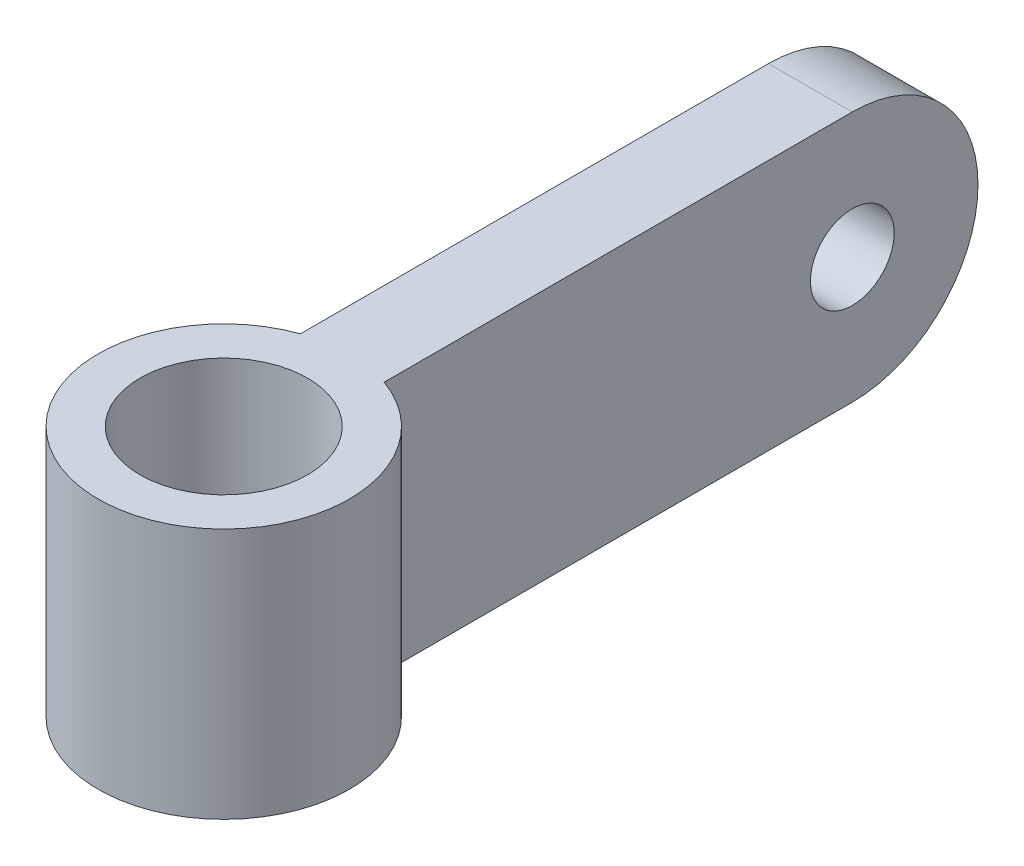
ISO-10303-21;
HEADER;
FILE_DESCRIPTION(('STEP AP214'),'2;1');
FILE_NAME('part.step','',(''),(''),'','','');
FILE_SCHEMA(('AUTOMOTIVE_DESIGN { 1 0 10303 214 1 1 1 1 }'));
ENDSEC;
DATA;
#1=APPLICATION_CONTEXT('core data for automotive mechanical design processes');
#2=APPLICATION_PROTOCOL_DEFINITION('international standard','automotive_design',2000,#1);
#3=PRODUCT_CONTEXT('',#1,'mechanical');
#4=PRODUCT('Part','Part','',(#3));
#5=PRODUCT_RELATED_PRODUCT_CATEGORY('part','',(#4));
#6=PRODUCT_DEFINITION_FORMATION('','',#4);
#7=PRODUCT_DEFINITION_CONTEXT('part definition',#1,'design');
#8=PRODUCT_DEFINITION('design','',#6,#7);
#9=PRODUCT_DEFINITION_SHAPE('','',#8);
#10=(LENGTH_UNIT() NAMED_UNIT(*) SI_UNIT(.MILLI.,.METRE.));
#11=(NAMED_UNIT(*) PLANE_ANGLE_UNIT() SI_UNIT($,.RADIAN.));
#12=(NAMED_UNIT(*) SI_UNIT($,.STERADIAN.) SOLID_ANGLE_UNIT());
#13=UNCERTAINTY_MEASURE_WITH_UNIT(LENGTH_MEASURE(1.E-05),#10,'distance_accuracy_value','');
#14=(GEOMETRIC_REPRESENTATION_CONTEXT(3) GLOBAL_UNCERTAINTY_ASSIGNED_CONTEXT((#13)) GLOBAL_UNIT_ASSIGNED_CONTEXT((#10,
#11,#12)) REPRESENTATION_CONTEXT('',''));
#15=CARTESIAN_POINT('',(0.,0.,0.));
#16=DIRECTION('',(0.,0.,1.));
#17=DIRECTION('',(1.,0.,0.));
#18=AXIS2_PLACEMENT_3D('',#15,#16,#17);
#19=CARTESIAN_POINT('',(0.,30.,0.));
#20=DIRECTION('',(0.,-1.,0.));
#21=DIRECTION('',(0.,0.,-1.));
#22=AXIS2_PLACEMENT_3D('',#19,#20,#21);
#23=CYLINDRICAL_SURFACE('',#22,30.);
#24=DIRECTION('',(0.,-1.,0.));
#25=VECTOR('',#24,1.);
#26=CARTESIAN_POINT('',(-10.,30.,-28.2842712474619));
#27=LINE('',#26,#25);
#28=CARTESIAN_POINT('',(-10.,30.,-28.2842712474619));
#29=VERTEX_POINT('',#28);
#30=CARTESIAN_POINT('',(-10.,-30.,-28.2842712474619));
#31=VERTEX_POINT('',#30);
#32=EDGE_CURVE('E137',#29,#31,#27,.T.);
#33=ORIENTED_EDGE('',*,*,#32,.T.);
#34=CARTESIAN_POINT('',(0.,-30.,0.));
#35=DIRECTION('',(0.,1.,0.));
#36=DIRECTION('',(0.,0.,1.));
#37=AXIS2_PLACEMENT_3D('',#34,#35,#36);
#38=CIRCLE('',#37,30.);
#39=CARTESIAN_POINT('',(10.,-30.,-28.2842712474576));
#40=VERTEX_POINT('',#39);
#41=EDGE_CURVE('E40',#31,#40,#38,.T.);
#42=ORIENTED_EDGE('',*,*,#41,.T.);
#43=DIRECTION('',(0.,-1.,0.));
#44=VECTOR('',#43,1.);
#45=CARTESIAN_POINT('',(10.,30.,-28.2842712474619));
#46=LINE('',#45,#44);
#47=CARTESIAN_POINT('',(10.,30.,-28.2842712474576));
#48=VERTEX_POINT('',#47);
#49=EDGE_CURVE('E105',#40,#48,#46,.F.);
#50=ORIENTED_EDGE('',*,*,#49,.T.);
#51=CARTESIAN_POINT('',(0.,30.,0.));
#52=DIRECTION('',(0.,1.,0.));
#53=DIRECTION('',(0.,0.,1.));
#54=AXIS2_PLACEMENT_3D('',#51,#52,#53);
#55=CIRCLE('',#54,30.);
#56=EDGE_CURVE('E11',#29,#48,#55,.T.);
#57=ORIENTED_EDGE('',*,*,#56,.F.);
#58=EDGE_LOOP('',(#33,#42,#50,#57));
#59=FACE_BOUND('',#58,.T.);
#60=ADVANCED_FACE('F37',(#59),#23,.T.);
#61=CARTESIAN_POINT('',(0.,30.,0.));
#62=DIRECTION('',(0.,1.,0.));
#63=DIRECTION('',(0.,0.,1.));
#64=AXIS2_PLACEMENT_3D('',#61,#62,#63);
#65=PLANE('',#64);
#66=DIRECTION('',(0.,0.,1.));
#67=VECTOR('',#66,1.);
#68=CARTESIAN_POINT('',(-10.,30.,-30.));
#69=LINE('',#68,#67);
#70=CARTESIAN_POINT('',(-10.,30.,-140.));
#71=VERTEX_POINT('',#70);
#72=EDGE_CURVE('E50',#71,#29,#69,.T.);
#73=ORIENTED_EDGE('',*,*,#72,.T.);
#74=ORIENTED_EDGE('',*,*,#56,.T.);
#75=DIRECTION('',(0.,0.,-1.));
#76=VECTOR('',#75,1.);
#77=CARTESIAN_POINT('',(10.,30.,500000.));
#78=LINE('',#77,#76);
#79=CARTESIAN_POINT('',(10.,30.,-140.));
#80=VERTEX_POINT('',#79);
#81=EDGE_CURVE('E106',#48,#80,#78,.T.);
#82=ORIENTED_EDGE('',*,*,#81,.T.);
#83=DIRECTION('',(-1.,0.,0.));
#84=VECTOR('',#83,1.);
#85=CARTESIAN_POINT('',(10.,30.,-140.));
#86=LINE('',#85,#84);
#87=EDGE_CURVE('E81',#80,#71,#86,.T.);
#88=ORIENTED_EDGE('',*,*,#87,.T.);
#89=EDGE_LOOP('',(#73,#74,#82,#88));
#90=FACE_BOUND('',#89,.T.);
#91=CARTESIAN_POINT('',(0.,30.,0.));
#92=DIRECTION('',(0.,1.,0.));
#93=DIRECTION('',(0.,0.,1.));
#94=AXIS2_PLACEMENT_3D('',#91,#92,#93);
#95=CIRCLE('',#94,20.);
#96=CARTESIAN_POINT('',(0.,30.,20.));
#97=VERTEX_POINT('',#96);
#98=EDGE_CURVE('E113',#97,#97,#95,.T.);
#99=ORIENTED_EDGE('',*,*,#98,.F.);
#100=EDGE_LOOP('',(#99));
#101=FACE_BOUND('',#100,.T.);
#102=ADVANCED_FACE('F130',(#90,#101),#65,.T.);
#103=CARTESIAN_POINT('',(0.,-30.,0.));
#104=DIRECTION('',(0.,1.,0.));
#105=DIRECTION('',(0.,0.,1.));
#106=AXIS2_PLACEMENT_3D('',#103,#104,#105);
#107=PLANE('',#106);
#108=ORIENTED_EDGE('',*,*,#41,.F.);
#109=DIRECTION('',(0.,0.,-1.));
#110=VECTOR('',#109,1.);
#111=CARTESIAN_POINT('',(-10.,-30.,-30.));
#112=LINE('',#111,#110);
#113=CARTESIAN_POINT('',(-10.,-30.,-140.));
#114=VERTEX_POINT('',#113);
#115=EDGE_CURVE('E58',#31,#114,#112,.T.);
#116=ORIENTED_EDGE('',*,*,#115,.T.);
#117=DIRECTION('',(-1.,0.,0.));
#118=VECTOR('',#117,1.);
#119=CARTESIAN_POINT('',(10.,-30.,-140.));
#120=LINE('',#119,#118);
#121=CARTESIAN_POINT('',(10.,-30.,-140.));
#122=VERTEX_POINT('',#121);
#123=EDGE_CURVE('E85',#114,#122,#120,.F.);
#124=ORIENTED_EDGE('',*,*,#123,.T.);
#125=DIRECTION('',(0.,0.,-1.));
#126=VECTOR('',#125,1.);
#127=CARTESIAN_POINT('',(10.,-30.,500000.));
#128=LINE('',#127,#126);
#129=EDGE_CURVE('E109',#40,#122,#128,.T.);
#130=ORIENTED_EDGE('',*,*,#129,.F.);
#131=EDGE_LOOP('',(#108,#116,#124,#130));
#132=FACE_BOUND('',#131,.T.);
#133=CARTESIAN_POINT('',(0.,-30.,0.));
#134=DIRECTION('',(0.,1.,0.));
#135=DIRECTION('',(0.,0.,1.));
#136=AXIS2_PLACEMENT_3D('',#133,#134,#135);
#137=CIRCLE('',#136,20.);
#138=CARTESIAN_POINT('',(0.,-30.,20.));
#139=VERTEX_POINT('',#138);
#140=EDGE_CURVE('E108',#139,#139,#137,.T.);
#141=ORIENTED_EDGE('',*,*,#140,.T.);
#142=EDGE_LOOP('',(#141));
#143=FACE_BOUND('',#142,.T.);
#144=ADVANCED_FACE('F92',(#132,#143),#107,.F.);
#145=CARTESIAN_POINT('',(0.,30.,0.));
#146=DIRECTION('',(0.,-1.,0.));
#147=DIRECTION('',(0.,0.,-1.));
#148=AXIS2_PLACEMENT_3D('',#145,#146,#147);
#149=CYLINDRICAL_SURFACE('',#148,20.);
#150=ORIENTED_EDGE('',*,*,#98,.T.);
#151=EDGE_LOOP('',(#150));
#152=FACE_BOUND('',#151,.T.);
#153=ORIENTED_EDGE('',*,*,#140,.F.);
#154=EDGE_LOOP('',(#153));
#155=FACE_BOUND('',#154,.T.);
#156=ADVANCED_FACE('F119',(#152,#155),#149,.F.);
#157=CARTESIAN_POINT('',(10.,-30.,500000.));
#158=DIRECTION('',(-1.,0.,0.));
#159=DIRECTION('',(0.,0.,1.));
#160=AXIS2_PLACEMENT_3D('',#157,#158,#159);
#161=PLANE('',#160);
#162=ORIENTED_EDGE('',*,*,#49,.F.);
#163=ORIENTED_EDGE('',*,*,#129,.T.);
#164=CARTESIAN_POINT('',(10.,0.,-140.));
#165=DIRECTION('',(1.,0.,0.));
#166=DIRECTION('',(0.,0.,-1.));
#167=AXIS2_PLACEMENT_3D('',#164,#165,#166);
#168=CIRCLE('',#167,30.);
#169=EDGE_CURVE('E80',#122,#80,#168,.T.);
#170=ORIENTED_EDGE('',*,*,#169,.T.);
#171=ORIENTED_EDGE('',*,*,#81,.F.);
#172=EDGE_LOOP('',(#162,#163,#170,#171));
#173=FACE_BOUND('',#172,.T.);
#174=CARTESIAN_POINT('',(10.,0.,-140.));
#175=DIRECTION('',(1.,0.,0.));
#176=DIRECTION('',(0.,0.,-1.));
#177=AXIS2_PLACEMENT_3D('',#174,#175,#176);
#178=CIRCLE('',#177,9.99999999999998);
#179=CARTESIAN_POINT('',(10.,0.,-150.));
#180=VERTEX_POINT('',#179);
#181=EDGE_CURVE('E98',#180,#180,#178,.T.);
#182=ORIENTED_EDGE('',*,*,#181,.F.);
#183=EDGE_LOOP('',(#182));
#184=FACE_BOUND('',#183,.T.);
#185=ADVANCED_FACE('F121',(#173,#184),#161,.F.);
#186=CARTESIAN_POINT('',(-10.,0.,-140.));
#187=DIRECTION('',(-1.,0.,0.));
#188=DIRECTION('',(0.,0.,1.));
#189=AXIS2_PLACEMENT_3D('',#186,#187,#188);
#190=CYLINDRICAL_SURFACE('',#189,30.);
#191=ORIENTED_EDGE('',*,*,#123,.F.);
#192=CARTESIAN_POINT('',(-10.,0.,-140.));
#193=DIRECTION('',(1.,0.,0.));
#194=DIRECTION('',(0.,0.,-1.));
#195=AXIS2_PLACEMENT_3D('',#192,#193,#194);
#196=CIRCLE('',#195,30.);
#197=EDGE_CURVE('E75',#71,#114,#196,.F.);
#198=ORIENTED_EDGE('',*,*,#197,.F.);
#199=ORIENTED_EDGE('',*,*,#87,.F.);
#200=ORIENTED_EDGE('',*,*,#169,.F.);
#201=EDGE_LOOP('',(#191,#198,#199,#200));
#202=FACE_BOUND('',#201,.T.);
#203=ADVANCED_FACE('F86',(#202),#190,.T.);
#204=CARTESIAN_POINT('',(-10.,0.,0.));
#205=DIRECTION('',(1.,0.,0.));
#206=DIRECTION('',(0.,0.,-1.));
#207=AXIS2_PLACEMENT_3D('',#204,#205,#206);
#208=PLANE('',#207);
#209=CARTESIAN_POINT('',(-10.,0.,-140.));
#210=DIRECTION('',(1.,0.,0.));
#211=DIRECTION('',(0.,0.,-1.));
#212=AXIS2_PLACEMENT_3D('',#209,#210,#211);
#213=CIRCLE('',#212,9.99999999999998);
#214=CARTESIAN_POINT('',(-10.,0.,-150.));
#215=VERTEX_POINT('',#214);
#216=EDGE_CURVE('E94',#215,#215,#213,.T.);
#217=ORIENTED_EDGE('',*,*,#216,.T.);
#218=EDGE_LOOP('',(#217));
#219=FACE_BOUND('',#218,.T.);
#220=ORIENTED_EDGE('',*,*,#72,.F.);
#221=ORIENTED_EDGE('',*,*,#197,.T.);
#222=ORIENTED_EDGE('',*,*,#115,.F.);
#223=ORIENTED_EDGE('',*,*,#32,.F.);
#224=EDGE_LOOP('',(#220,#221,#222,#223));
#225=FACE_BOUND('',#224,.T.);
#226=ADVANCED_FACE('F77',(#219,#225),#208,.F.);
#227=CARTESIAN_POINT('',(-30.,0.,-140.));
#228=DIRECTION('',(1.,0.,0.));
#229=DIRECTION('',(0.,0.,-1.));
#230=AXIS2_PLACEMENT_3D('',#227,#228,#229);
#231=CYLINDRICAL_SURFACE('',#230,9.99999999999998);
#232=ORIENTED_EDGE('',*,*,#181,.T.);
#233=EDGE_LOOP('',(#232));
#234=FACE_BOUND('',#233,.T.);
#235=ORIENTED_EDGE('',*,*,#216,.F.);
#236=EDGE_LOOP('',(#235));
#237=FACE_BOUND('',#236,.T.);
#238=ADVANCED_FACE('F142',(#234,#237),#231,.F.);
#239=CLOSED_SHELL('',(#60,#102,#144,#156,#185,#203,#226,#238));
#240=MANIFOLD_SOLID_BREP('B2',#239);
#241=ADVANCED_BREP_SHAPE_REPRESENTATION('',(#18,#240),#14);
#242=SHAPE_DEFINITION_REPRESENTATION(#9,#241);
ENDSEC;
END-ISO-10303-21;
